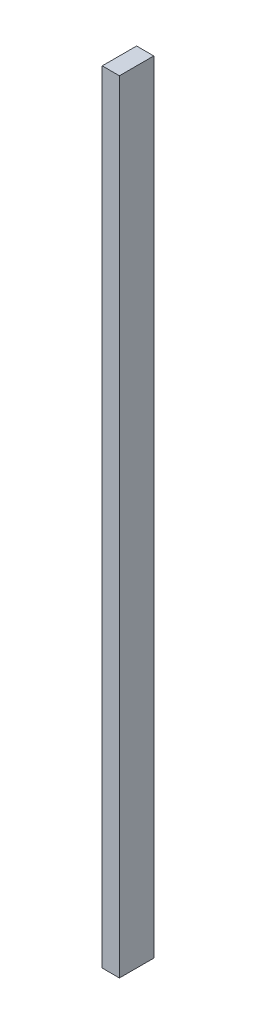
ISO-10303-21;
HEADER;
FILE_DESCRIPTION(('STEP AP214'),'2;1');
FILE_NAME('part.step','',(''),(''),'','','');
FILE_SCHEMA(('AUTOMOTIVE_DESIGN { 1 0 10303 214 1 1 1 1 }'));
ENDSEC;
DATA;
#1=APPLICATION_CONTEXT('core data for automotive mechanical design processes');
#2=APPLICATION_PROTOCOL_DEFINITION('international standard','automotive_design',2000,#1);
#3=PRODUCT_CONTEXT('',#1,'mechanical');
#4=PRODUCT('Part','Part','',(#3));
#5=PRODUCT_RELATED_PRODUCT_CATEGORY('part','',(#4));
#6=PRODUCT_DEFINITION_FORMATION('','',#4);
#7=PRODUCT_DEFINITION_CONTEXT('part definition',#1,'design');
#8=PRODUCT_DEFINITION('design','',#6,#7);
#9=PRODUCT_DEFINITION_SHAPE('','',#8);
#10=(LENGTH_UNIT() NAMED_UNIT(*) SI_UNIT(.MILLI.,.METRE.));
#11=(NAMED_UNIT(*) PLANE_ANGLE_UNIT() SI_UNIT($,.RADIAN.));
#12=(NAMED_UNIT(*) SI_UNIT($,.STERADIAN.) SOLID_ANGLE_UNIT());
#13=UNCERTAINTY_MEASURE_WITH_UNIT(LENGTH_MEASURE(1.E-05),#10,'distance_accuracy_value','');
#14=(GEOMETRIC_REPRESENTATION_CONTEXT(3) GLOBAL_UNCERTAINTY_ASSIGNED_CONTEXT((#13)) GLOBAL_UNIT_ASSIGNED_CONTEXT((#10,
#11,#12)) REPRESENTATION_CONTEXT('',''));
#15=CARTESIAN_POINT('',(0.,0.,0.));
#16=DIRECTION('',(0.,0.,1.));
#17=DIRECTION('',(1.,0.,0.));
#18=AXIS2_PLACEMENT_3D('',#15,#16,#17);
#19=CARTESIAN_POINT('',(12.7,1155.192,25.4));
#20=DIRECTION('',(-1.,0.,0.));
#21=DIRECTION('',(0.,0.,1.));
#22=AXIS2_PLACEMENT_3D('',#19,#20,#21);
#23=PLANE('',#22);
#24=DIRECTION('',(0.,0.,-1.));
#25=VECTOR('',#24,1.);
#26=CARTESIAN_POINT('',(12.7,0.,25.4));
#27=LINE('',#26,#25);
#28=CARTESIAN_POINT('',(12.7,0.,25.4));
#29=VERTEX_POINT('',#28);
#30=CARTESIAN_POINT('',(12.7,0.,-25.4));
#31=VERTEX_POINT('',#30);
#32=EDGE_CURVE('E111',#29,#31,#27,.T.);
#33=ORIENTED_EDGE('',*,*,#32,.T.);
#34=DIRECTION('',(0.,-1.,0.));
#35=VECTOR('',#34,1.);
#36=CARTESIAN_POINT('',(12.7,1155.192,-25.4));
#37=LINE('',#36,#35);
#38=CARTESIAN_POINT('',(12.7,1155.192,-25.4));
#39=VERTEX_POINT('',#38);
#40=EDGE_CURVE('E11',#39,#31,#37,.T.);
#41=ORIENTED_EDGE('',*,*,#40,.F.);
#42=DIRECTION('',(0.,0.,-1.));
#43=VECTOR('',#42,1.);
#44=CARTESIAN_POINT('',(12.7,1155.192,25.4));
#45=LINE('',#44,#43);
#46=CARTESIAN_POINT('',(12.7,1155.192,25.4));
#47=VERTEX_POINT('',#46);
#48=EDGE_CURVE('E95',#47,#39,#45,.T.);
#49=ORIENTED_EDGE('',*,*,#48,.F.);
#50=DIRECTION('',(0.,-1.,0.));
#51=VECTOR('',#50,1.);
#52=CARTESIAN_POINT('',(12.7,1155.192,25.4));
#53=LINE('',#52,#51);
#54=EDGE_CURVE('E107',#47,#29,#53,.T.);
#55=ORIENTED_EDGE('',*,*,#54,.T.);
#56=EDGE_LOOP('',(#33,#41,#49,#55));
#57=FACE_BOUND('',#56,.T.);
#58=ADVANCED_FACE('F43',(#57),#23,.F.);
#59=CARTESIAN_POINT('',(-12.7,1155.192,-25.4));
#60=DIRECTION('',(0.,0.,1.));
#61=DIRECTION('',(1.,0.,0.));
#62=AXIS2_PLACEMENT_3D('',#59,#60,#61);
#63=PLANE('',#62);
#64=DIRECTION('',(-1.,0.,0.));
#65=VECTOR('',#64,1.);
#66=CARTESIAN_POINT('',(-12.7,0.,-25.4));
#67=LINE('',#66,#65);
#68=CARTESIAN_POINT('',(-12.7,0.,-25.4));
#69=VERTEX_POINT('',#68);
#70=EDGE_CURVE('E100',#31,#69,#67,.T.);
#71=ORIENTED_EDGE('',*,*,#70,.T.);
#72=DIRECTION('',(0.,-1.,0.));
#73=VECTOR('',#72,1.);
#74=CARTESIAN_POINT('',(-12.7,1155.192,-25.4));
#75=LINE('',#74,#73);
#76=CARTESIAN_POINT('',(-12.7,1155.192,-25.4));
#77=VERTEX_POINT('',#76);
#78=EDGE_CURVE('E52',#77,#69,#75,.T.);
#79=ORIENTED_EDGE('',*,*,#78,.F.);
#80=DIRECTION('',(-1.,0.,0.));
#81=VECTOR('',#80,1.);
#82=CARTESIAN_POINT('',(-12.7,1155.192,-25.4));
#83=LINE('',#82,#81);
#84=EDGE_CURVE('E90',#39,#77,#83,.T.);
#85=ORIENTED_EDGE('',*,*,#84,.F.);
#86=ORIENTED_EDGE('',*,*,#40,.T.);
#87=EDGE_LOOP('',(#71,#79,#85,#86));
#88=FACE_BOUND('',#87,.T.);
#89=ADVANCED_FACE('F99',(#88),#63,.F.);
#90=CARTESIAN_POINT('',(-12.7,1155.192,25.4));
#91=DIRECTION('',(1.,0.,0.));
#92=DIRECTION('',(0.,0.,-1.));
#93=AXIS2_PLACEMENT_3D('',#90,#91,#92);
#94=PLANE('',#93);
#95=DIRECTION('',(0.,0.,1.));
#96=VECTOR('',#95,1.);
#97=CARTESIAN_POINT('',(-12.7,0.,25.4));
#98=LINE('',#97,#96);
#99=CARTESIAN_POINT('',(-12.7,0.,25.4));
#100=VERTEX_POINT('',#99);
#101=EDGE_CURVE('E77',#69,#100,#98,.T.);
#102=ORIENTED_EDGE('',*,*,#101,.T.);
#103=DIRECTION('',(0.,-1.,0.));
#104=VECTOR('',#103,1.);
#105=CARTESIAN_POINT('',(-12.7,1155.192,25.4));
#106=LINE('',#105,#104);
#107=CARTESIAN_POINT('',(-12.7,1155.192,25.4));
#108=VERTEX_POINT('',#107);
#109=EDGE_CURVE('E102',#108,#100,#106,.T.);
#110=ORIENTED_EDGE('',*,*,#109,.F.);
#111=DIRECTION('',(0.,0.,1.));
#112=VECTOR('',#111,1.);
#113=CARTESIAN_POINT('',(-12.7,1155.192,25.4));
#114=LINE('',#113,#112);
#115=EDGE_CURVE('E93',#77,#108,#114,.T.);
#116=ORIENTED_EDGE('',*,*,#115,.F.);
#117=ORIENTED_EDGE('',*,*,#78,.T.);
#118=EDGE_LOOP('',(#102,#110,#116,#117));
#119=FACE_BOUND('',#118,.T.);
#120=ADVANCED_FACE('F103',(#119),#94,.F.);
#121=CARTESIAN_POINT('',(-12.7,1155.192,25.4));
#122=DIRECTION('',(0.,0.,-1.));
#123=DIRECTION('',(-1.,0.,0.));
#124=AXIS2_PLACEMENT_3D('',#121,#122,#123);
#125=PLANE('',#124);
#126=DIRECTION('',(1.,0.,0.));
#127=VECTOR('',#126,1.);
#128=CARTESIAN_POINT('',(-12.7,0.,25.4));
#129=LINE('',#128,#127);
#130=EDGE_CURVE('E83',#100,#29,#129,.T.);
#131=ORIENTED_EDGE('',*,*,#130,.T.);
#132=ORIENTED_EDGE('',*,*,#54,.F.);
#133=DIRECTION('',(1.,0.,0.));
#134=VECTOR('',#133,1.);
#135=CARTESIAN_POINT('',(-12.7,1155.192,25.4));
#136=LINE('',#135,#134);
#137=EDGE_CURVE('E60',#108,#47,#136,.T.);
#138=ORIENTED_EDGE('',*,*,#137,.F.);
#139=ORIENTED_EDGE('',*,*,#109,.T.);
#140=EDGE_LOOP('',(#131,#132,#138,#139));
#141=FACE_BOUND('',#140,.T.);
#142=ADVANCED_FACE('F124',(#141),#125,.F.);
#143=CARTESIAN_POINT('',(0.,1155.192,0.));
#144=DIRECTION('',(0.,-1.,0.));
#145=DIRECTION('',(0.,0.,-1.));
#146=AXIS2_PLACEMENT_3D('',#143,#144,#145);
#147=PLANE('',#146);
#148=ORIENTED_EDGE('',*,*,#48,.T.);
#149=ORIENTED_EDGE('',*,*,#84,.T.);
#150=ORIENTED_EDGE('',*,*,#115,.T.);
#151=ORIENTED_EDGE('',*,*,#137,.T.);
#152=EDGE_LOOP('',(#148,#149,#150,#151));
#153=FACE_BOUND('',#152,.T.);
#154=ADVANCED_FACE('F91',(#153),#147,.F.);
#155=CARTESIAN_POINT('',(0.,0.,0.));
#156=DIRECTION('',(0.,-1.,0.));
#157=DIRECTION('',(0.,0.,-1.));
#158=AXIS2_PLACEMENT_3D('',#155,#156,#157);
#159=PLANE('',#158);
#160=ORIENTED_EDGE('',*,*,#32,.F.);
#161=ORIENTED_EDGE('',*,*,#130,.F.);
#162=ORIENTED_EDGE('',*,*,#101,.F.);
#163=ORIENTED_EDGE('',*,*,#70,.F.);
#164=EDGE_LOOP('',(#160,#161,#162,#163));
#165=FACE_BOUND('',#164,.T.);
#166=ADVANCED_FACE('F127',(#165),#159,.T.);
#167=CLOSED_SHELL('',(#58,#89,#120,#142,#154,#166));
#168=MANIFOLD_SOLID_BREP('B2',#167);
#169=ADVANCED_BREP_SHAPE_REPRESENTATION('',(#18,#168),#14);
#170=SHAPE_DEFINITION_REPRESENTATION(#9,#169);
ENDSEC;
END-ISO-10303-21;
